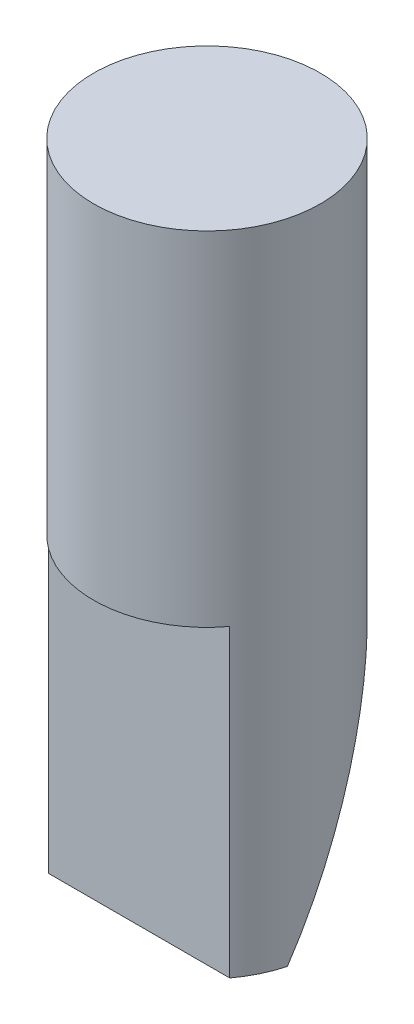
ISO-10303-21;
HEADER;
FILE_DESCRIPTION(('STEP AP214'),'2;1');
FILE_NAME('part.step','',(''),(''),'','','');
FILE_SCHEMA(('AUTOMOTIVE_DESIGN { 1 0 10303 214 1 1 1 1 }'));
ENDSEC;
DATA;
#1=APPLICATION_CONTEXT('core data for automotive mechanical design processes');
#2=APPLICATION_PROTOCOL_DEFINITION('international standard','automotive_design',2000,#1);
#3=PRODUCT_CONTEXT('',#1,'mechanical');
#4=PRODUCT('Part','Part','',(#3));
#5=PRODUCT_RELATED_PRODUCT_CATEGORY('part','',(#4));
#6=PRODUCT_DEFINITION_FORMATION('','',#4);
#7=PRODUCT_DEFINITION_CONTEXT('part definition',#1,'design');
#8=PRODUCT_DEFINITION('design','',#6,#7);
#9=PRODUCT_DEFINITION_SHAPE('','',#8);
#10=(LENGTH_UNIT() NAMED_UNIT(*) SI_UNIT(.MILLI.,.METRE.));
#11=(NAMED_UNIT(*) PLANE_ANGLE_UNIT() SI_UNIT($,.RADIAN.));
#12=(NAMED_UNIT(*) SI_UNIT($,.STERADIAN.) SOLID_ANGLE_UNIT());
#13=UNCERTAINTY_MEASURE_WITH_UNIT(LENGTH_MEASURE(1.E-05),#10,'distance_accuracy_value','');
#14=(GEOMETRIC_REPRESENTATION_CONTEXT(3) GLOBAL_UNCERTAINTY_ASSIGNED_CONTEXT((#13)) GLOBAL_UNIT_ASSIGNED_CONTEXT((#10,
#11,#12)) REPRESENTATION_CONTEXT('',''));
#15=CARTESIAN_POINT('',(0.,0.,0.));
#16=DIRECTION('',(0.,0.,1.));
#17=DIRECTION('',(1.,0.,0.));
#18=AXIS2_PLACEMENT_3D('',#15,#16,#17);
#19=CARTESIAN_POINT('',(0.,100.,0.));
#20=DIRECTION('',(0.,-1.,0.));
#21=DIRECTION('',(0.,0.,-1.));
#22=AXIS2_PLACEMENT_3D('',#19,#20,#21);
#23=CYLINDRICAL_SURFACE('',#22,17.5);
#24=CARTESIAN_POINT('',(0.,100.,0.));
#25=DIRECTION('',(0.,1.,0.));
#26=DIRECTION('',(0.,0.,1.));
#27=AXIS2_PLACEMENT_3D('',#24,#25,#26);
#28=CIRCLE('',#27,17.5);
#29=CARTESIAN_POINT('',(0.,100.,17.5));
#30=VERTEX_POINT('',#29);
#31=EDGE_CURVE('E92',#30,#30,#28,.T.);
#32=ORIENTED_EDGE('',*,*,#31,.F.);
#33=EDGE_LOOP('',(#32));
#34=FACE_BOUND('',#33,.T.);
#35=CARTESIAN_POINT('',(0.,47.,0.));
#36=DIRECTION('',(0.,1.,0.));
#37=DIRECTION('',(0.,0.,1.));
#38=AXIS2_PLACEMENT_3D('',#35,#36,#37);
#39=CIRCLE('',#38,17.5);
#40=CARTESIAN_POINT('',(-14.,47.,10.5));
#41=VERTEX_POINT('',#40);
#42=CARTESIAN_POINT('',(14.,47.,10.5));
#43=VERTEX_POINT('',#42);
#44=EDGE_CURVE('E11',#41,#43,#39,.T.);
#45=ORIENTED_EDGE('',*,*,#44,.T.);
#46=DIRECTION('',(0.,-1.,0.));
#47=VECTOR('',#46,1.);
#48=CARTESIAN_POINT('',(14.,100.,10.5));
#49=LINE('',#48,#47);
#50=CARTESIAN_POINT('',(14.,0.,10.5));
#51=VERTEX_POINT('',#50);
#52=EDGE_CURVE('E95',#43,#51,#49,.T.);
#53=ORIENTED_EDGE('',*,*,#52,.T.);
#54=CARTESIAN_POINT('',(0.,0.,0.));
#55=DIRECTION('',(0.,1.,0.));
#56=DIRECTION('',(0.,0.,1.));
#57=AXIS2_PLACEMENT_3D('',#54,#55,#56);
#58=CIRCLE('',#57,17.5);
#59=CARTESIAN_POINT('',(16.9115345252878,0.,4.50000000000001));
#60=VERTEX_POINT('',#59);
#61=EDGE_CURVE('E85',#51,#60,#58,.T.);
#62=ORIENTED_EDGE('',*,*,#61,.T.);
#63=CARTESIAN_POINT('',(0.,9.61363636363637,0.));
#64=DIRECTION('',(0.,0.423940106048631,0.905690226558438));
#65=DIRECTION('',(0.,-0.905690226558438,0.423940106048631));
#66=AXIS2_PLACEMENT_3D('',#63,#64,#65);
#67=ELLIPSE('',#66,41.2794160078654,17.5);
#68=CARTESIAN_POINT('',(-16.9115345252878,0.,4.50000000000001));
#69=VERTEX_POINT('',#68);
#70=EDGE_CURVE('E68',#60,#69,#67,.T.);
#71=ORIENTED_EDGE('',*,*,#70,.T.);
#72=CARTESIAN_POINT('',(-14.,0.,10.5));
#73=VERTEX_POINT('',#72);
#74=EDGE_CURVE('E82',#69,#73,#58,.T.);
#75=ORIENTED_EDGE('',*,*,#74,.T.);
#76=DIRECTION('',(0.,-1.,0.));
#77=VECTOR('',#76,1.);
#78=CARTESIAN_POINT('',(-14.,100.,10.5));
#79=LINE('',#78,#77);
#80=EDGE_CURVE('E61',#73,#41,#79,.F.);
#81=ORIENTED_EDGE('',*,*,#80,.T.);
#82=EDGE_LOOP('',(#45,#53,#62,#71,#75,#81));
#83=FACE_BOUND('',#82,.T.);
#84=ADVANCED_FACE('F47',(#34,#83),#23,.T.);
#85=CARTESIAN_POINT('',(0.,100.,0.));
#86=DIRECTION('',(0.,1.,0.));
#87=DIRECTION('',(0.,0.,1.));
#88=AXIS2_PLACEMENT_3D('',#85,#86,#87);
#89=PLANE('',#88);
#90=ORIENTED_EDGE('',*,*,#31,.T.);
#91=EDGE_LOOP('',(#90));
#92=FACE_BOUND('',#91,.T.);
#93=ADVANCED_FACE('F116',(#92),#89,.T.);
#94=CARTESIAN_POINT('',(0.,0.,0.));
#95=DIRECTION('',(0.,1.,0.));
#96=DIRECTION('',(0.,0.,1.));
#97=AXIS2_PLACEMENT_3D('',#94,#95,#96);
#98=PLANE('',#97);
#99=ORIENTED_EDGE('',*,*,#61,.F.);
#100=DIRECTION('',(-1.,0.,0.));
#101=VECTOR('',#100,1.);
#102=CARTESIAN_POINT('',(0.,0.,10.5));
#103=LINE('',#102,#101);
#104=EDGE_CURVE('E54',#51,#73,#103,.T.);
#105=ORIENTED_EDGE('',*,*,#104,.T.);
#106=ORIENTED_EDGE('',*,*,#74,.F.);
#107=DIRECTION('',(1.,0.,0.));
#108=VECTOR('',#107,1.);
#109=CARTESIAN_POINT('',(0.,0.,4.50000000000001));
#110=LINE('',#109,#108);
#111=EDGE_CURVE('E89',#69,#60,#110,.T.);
#112=ORIENTED_EDGE('',*,*,#111,.T.);
#113=EDGE_LOOP('',(#99,#105,#106,#112));
#114=FACE_BOUND('',#113,.T.);
#115=ADVANCED_FACE('F94',(#114),#98,.F.);
#116=CARTESIAN_POINT('',(-17.5,0.,4.50000000000001));
#117=DIRECTION('',(0.,0.423940106048631,0.905690226558438));
#118=DIRECTION('',(0.,-0.905690226558438,0.423940106048631));
#119=AXIS2_PLACEMENT_3D('',#116,#117,#118);
#120=PLANE('',#119);
#121=ORIENTED_EDGE('',*,*,#111,.F.);
#122=ORIENTED_EDGE('',*,*,#70,.F.);
#123=EDGE_LOOP('',(#121,#122));
#124=FACE_BOUND('',#123,.T.);
#125=ADVANCED_FACE('F90',(#124),#120,.F.);
#126=CARTESIAN_POINT('',(-17.5,47.,17.5));
#127=DIRECTION('',(0.,1.,0.));
#128=DIRECTION('',(0.,0.,1.));
#129=AXIS2_PLACEMENT_3D('',#126,#127,#128);
#130=PLANE('',#129);
#131=ORIENTED_EDGE('',*,*,#44,.F.);
#132=DIRECTION('',(1.,0.,0.));
#133=VECTOR('',#132,1.);
#134=CARTESIAN_POINT('',(-17.5,47.,10.5));
#135=LINE('',#134,#133);
#136=EDGE_CURVE('E87',#41,#43,#135,.T.);
#137=ORIENTED_EDGE('',*,*,#136,.T.);
#138=EDGE_LOOP('',(#131,#137));
#139=FACE_BOUND('',#138,.T.);
#140=ADVANCED_FACE('F105',(#139),#130,.F.);
#141=CARTESIAN_POINT('',(-17.5,47.,10.5));
#142=DIRECTION('',(0.,0.,-1.));
#143=DIRECTION('',(0.,1.,0.));
#144=AXIS2_PLACEMENT_3D('',#141,#142,#143);
#145=PLANE('',#144);
#146=ORIENTED_EDGE('',*,*,#136,.F.);
#147=ORIENTED_EDGE('',*,*,#80,.F.);
#148=ORIENTED_EDGE('',*,*,#104,.F.);
#149=ORIENTED_EDGE('',*,*,#52,.F.);
#150=EDGE_LOOP('',(#146,#147,#148,#149));
#151=FACE_BOUND('',#150,.T.);
#152=ADVANCED_FACE('F107',(#151),#145,.F.);
#153=CLOSED_SHELL('',(#84,#93,#115,#125,#140,#152));
#154=MANIFOLD_SOLID_BREP('B2',#153);
#155=ADVANCED_BREP_SHAPE_REPRESENTATION('',(#18,#154),#14);
#156=SHAPE_DEFINITION_REPRESENTATION(#9,#155);
ENDSEC;
END-ISO-10303-21;
